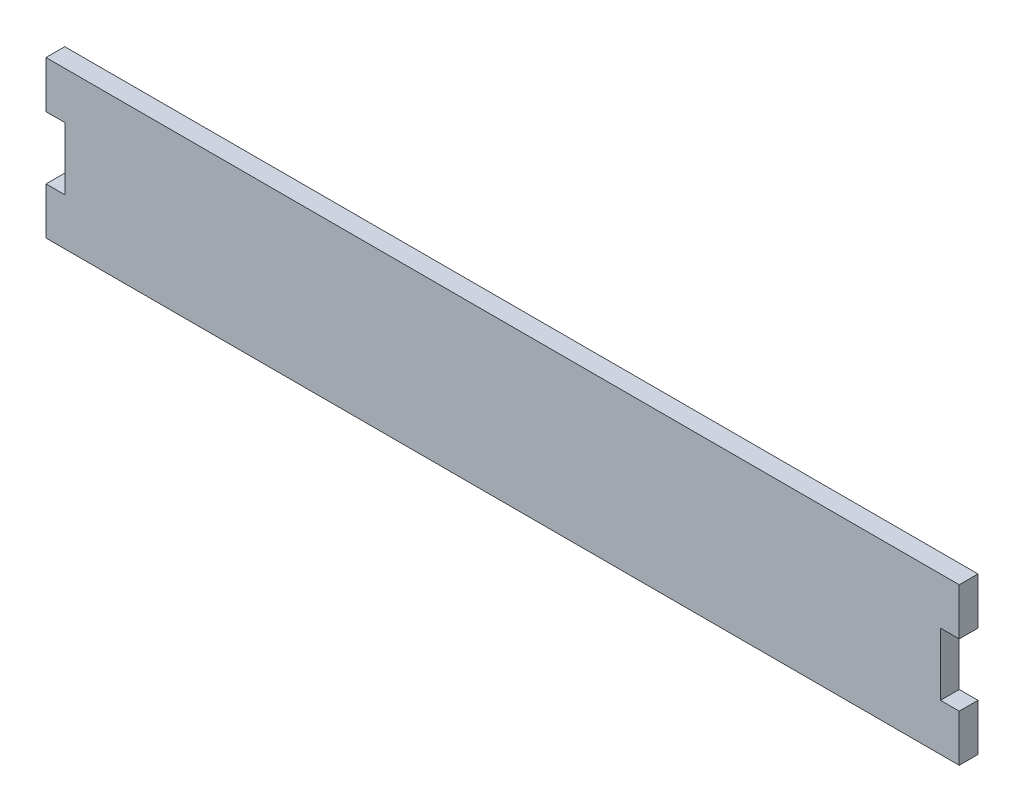
ISO-10303-21;
HEADER;
FILE_DESCRIPTION(('STEP AP214'),'2;1');
FILE_NAME('part.step','',(''),(''),'','','');
FILE_SCHEMA(('AUTOMOTIVE_DESIGN { 1 0 10303 214 1 1 1 1 }'));
ENDSEC;
DATA;
#1=APPLICATION_CONTEXT('core data for automotive mechanical design processes');
#2=APPLICATION_PROTOCOL_DEFINITION('international standard','automotive_design',2000,#1);
#3=PRODUCT_CONTEXT('',#1,'mechanical');
#4=PRODUCT('Part','Part','',(#3));
#5=PRODUCT_RELATED_PRODUCT_CATEGORY('part','',(#4));
#6=PRODUCT_DEFINITION_FORMATION('','',#4);
#7=PRODUCT_DEFINITION_CONTEXT('part definition',#1,'design');
#8=PRODUCT_DEFINITION('design','',#6,#7);
#9=PRODUCT_DEFINITION_SHAPE('','',#8);
#10=(LENGTH_UNIT() NAMED_UNIT(*) SI_UNIT(.MILLI.,.METRE.));
#11=(NAMED_UNIT(*) PLANE_ANGLE_UNIT() SI_UNIT($,.RADIAN.));
#12=(NAMED_UNIT(*) SI_UNIT($,.STERADIAN.) SOLID_ANGLE_UNIT());
#13=UNCERTAINTY_MEASURE_WITH_UNIT(LENGTH_MEASURE(1.E-05),#10,'distance_accuracy_value','');
#14=(GEOMETRIC_REPRESENTATION_CONTEXT(3) GLOBAL_UNCERTAINTY_ASSIGNED_CONTEXT((#13)) GLOBAL_UNIT_ASSIGNED_CONTEXT((#10,
#11,#12)) REPRESENTATION_CONTEXT('',''));
#15=CARTESIAN_POINT('',(0.,0.,0.));
#16=DIRECTION('',(0.,0.,1.));
#17=DIRECTION('',(1.,0.,0.));
#18=AXIS2_PLACEMENT_3D('',#15,#16,#17);
#19=CARTESIAN_POINT('',(292.,0.,6.));
#20=DIRECTION('',(-1.,0.,0.));
#21=DIRECTION('',(0.,0.,1.));
#22=AXIS2_PLACEMENT_3D('',#19,#20,#21);
#23=PLANE('',#22);
#24=DIRECTION('',(0.,1.,0.));
#25=VECTOR('',#24,1.);
#26=CARTESIAN_POINT('',(292.,0.,6.));
#27=LINE('',#26,#25);
#28=CARTESIAN_POINT('',(292.,35.,6.));
#29=VERTEX_POINT('',#28);
#30=CARTESIAN_POINT('',(292.,50.,6.));
#31=VERTEX_POINT('',#30);
#32=EDGE_CURVE('E145',#29,#31,#27,.T.);
#33=ORIENTED_EDGE('',*,*,#32,.F.);
#34=DIRECTION('',(0.,0.,-1.));
#35=VECTOR('',#34,1.);
#36=CARTESIAN_POINT('',(292.,35.,6.));
#37=LINE('',#36,#35);
#38=CARTESIAN_POINT('',(292.,35.,0.));
#39=VERTEX_POINT('',#38);
#40=EDGE_CURVE('E183',#29,#39,#37,.T.);
#41=ORIENTED_EDGE('',*,*,#40,.T.);
#42=DIRECTION('',(0.,1.,0.));
#43=VECTOR('',#42,1.);
#44=CARTESIAN_POINT('',(292.,0.,0.));
#45=LINE('',#44,#43);
#46=CARTESIAN_POINT('',(292.,50.,0.));
#47=VERTEX_POINT('',#46);
#48=EDGE_CURVE('E158',#39,#47,#45,.T.);
#49=ORIENTED_EDGE('',*,*,#48,.T.);
#50=DIRECTION('',(0.,0.,-1.));
#51=VECTOR('',#50,1.);
#52=CARTESIAN_POINT('',(292.,50.,6.));
#53=LINE('',#52,#51);
#54=EDGE_CURVE('E165',#31,#47,#53,.T.);
#55=ORIENTED_EDGE('',*,*,#54,.F.);
#56=EDGE_LOOP('',(#33,#41,#49,#55));
#57=FACE_BOUND('',#56,.T.);
#58=ADVANCED_FACE('F32',(#57),#23,.F.);
#59=CARTESIAN_POINT('',(0.,0.,6.));
#60=DIRECTION('',(1.,0.,0.));
#61=DIRECTION('',(0.,0.,-1.));
#62=AXIS2_PLACEMENT_3D('',#59,#60,#61);
#63=PLANE('',#62);
#64=DIRECTION('',(0.,-1.,0.));
#65=VECTOR('',#64,1.);
#66=CARTESIAN_POINT('',(0.,0.,0.));
#67=LINE('',#66,#65);
#68=CARTESIAN_POINT('',(0.,50.,0.));
#69=VERTEX_POINT('',#68);
#70=CARTESIAN_POINT('',(0.,35.,0.));
#71=VERTEX_POINT('',#70);
#72=EDGE_CURVE('E152',#69,#71,#67,.T.);
#73=ORIENTED_EDGE('',*,*,#72,.T.);
#74=DIRECTION('',(0.,0.,-1.));
#75=VECTOR('',#74,1.);
#76=CARTESIAN_POINT('',(0.,35.,6.));
#77=LINE('',#76,#75);
#78=CARTESIAN_POINT('',(0.,35.,6.));
#79=VERTEX_POINT('',#78);
#80=EDGE_CURVE('E207',#79,#71,#77,.T.);
#81=ORIENTED_EDGE('',*,*,#80,.F.);
#82=DIRECTION('',(0.,-1.,0.));
#83=VECTOR('',#82,1.);
#84=CARTESIAN_POINT('',(0.,0.,6.));
#85=LINE('',#84,#83);
#86=CARTESIAN_POINT('',(0.,50.,6.));
#87=VERTEX_POINT('',#86);
#88=EDGE_CURVE('E212',#87,#79,#85,.T.);
#89=ORIENTED_EDGE('',*,*,#88,.F.);
#90=DIRECTION('',(0.,0.,-1.));
#91=VECTOR('',#90,1.);
#92=CARTESIAN_POINT('',(0.,50.,6.));
#93=LINE('',#92,#91);
#94=EDGE_CURVE('E147',#87,#69,#93,.T.);
#95=ORIENTED_EDGE('',*,*,#94,.T.);
#96=EDGE_LOOP('',(#73,#81,#89,#95));
#97=FACE_BOUND('',#96,.T.);
#98=ADVANCED_FACE('F230',(#97),#63,.F.);
#99=CARTESIAN_POINT('',(0.,15.,6.));
#100=VERTEX_POINT('',#99);
#101=CARTESIAN_POINT('',(0.,0.,6.));
#102=VERTEX_POINT('',#101);
#103=EDGE_CURVE('E162',#100,#102,#85,.T.);
#104=ORIENTED_EDGE('',*,*,#103,.F.);
#105=DIRECTION('',(0.,0.,-1.));
#106=VECTOR('',#105,1.);
#107=CARTESIAN_POINT('',(0.,15.,6.));
#108=LINE('',#107,#106);
#109=CARTESIAN_POINT('',(0.,15.,0.));
#110=VERTEX_POINT('',#109);
#111=EDGE_CURVE('E209',#100,#110,#108,.T.);
#112=ORIENTED_EDGE('',*,*,#111,.T.);
#113=CARTESIAN_POINT('',(0.,0.,0.));
#114=VERTEX_POINT('',#113);
#115=EDGE_CURVE('E156',#110,#114,#67,.T.);
#116=ORIENTED_EDGE('',*,*,#115,.T.);
#117=DIRECTION('',(0.,0.,-1.));
#118=VECTOR('',#117,1.);
#119=CARTESIAN_POINT('',(0.,0.,6.));
#120=LINE('',#119,#118);
#121=EDGE_CURVE('E11',#102,#114,#120,.T.);
#122=ORIENTED_EDGE('',*,*,#121,.F.);
#123=EDGE_LOOP('',(#104,#112,#116,#122));
#124=FACE_BOUND('',#123,.T.);
#125=ADVANCED_FACE('F34',(#124),#63,.F.);
#126=CARTESIAN_POINT('',(0.,0.,6.));
#127=DIRECTION('',(0.,1.,0.));
#128=DIRECTION('',(0.,0.,1.));
#129=AXIS2_PLACEMENT_3D('',#126,#127,#128);
#130=PLANE('',#129);
#131=DIRECTION('',(1.,0.,0.));
#132=VECTOR('',#131,1.);
#133=CARTESIAN_POINT('',(0.,0.,0.));
#134=LINE('',#133,#132);
#135=CARTESIAN_POINT('',(292.,0.,0.));
#136=VERTEX_POINT('',#135);
#137=EDGE_CURVE('E155',#114,#136,#134,.T.);
#138=ORIENTED_EDGE('',*,*,#137,.T.);
#139=DIRECTION('',(0.,0.,-1.));
#140=VECTOR('',#139,1.);
#141=CARTESIAN_POINT('',(292.,0.,6.));
#142=LINE('',#141,#140);
#143=CARTESIAN_POINT('',(292.,0.,6.));
#144=VERTEX_POINT('',#143);
#145=EDGE_CURVE('E40',#144,#136,#142,.T.);
#146=ORIENTED_EDGE('',*,*,#145,.F.);
#147=DIRECTION('',(1.,0.,0.));
#148=VECTOR('',#147,1.);
#149=CARTESIAN_POINT('',(0.,0.,6.));
#150=LINE('',#149,#148);
#151=EDGE_CURVE('E142',#102,#144,#150,.T.);
#152=ORIENTED_EDGE('',*,*,#151,.F.);
#153=ORIENTED_EDGE('',*,*,#121,.T.);
#154=EDGE_LOOP('',(#138,#146,#152,#153));
#155=FACE_BOUND('',#154,.T.);
#156=ADVANCED_FACE('F219',(#155),#130,.F.);
#157=CARTESIAN_POINT('',(292.,15.,0.));
#158=VERTEX_POINT('',#157);
#159=EDGE_CURVE('E137',#136,#158,#45,.T.);
#160=ORIENTED_EDGE('',*,*,#159,.T.);
#161=DIRECTION('',(0.,0.,-1.));
#162=VECTOR('',#161,1.);
#163=CARTESIAN_POINT('',(292.,15.,6.));
#164=LINE('',#163,#162);
#165=CARTESIAN_POINT('',(292.,15.,6.));
#166=VERTEX_POINT('',#165);
#167=EDGE_CURVE('E47',#166,#158,#164,.T.);
#168=ORIENTED_EDGE('',*,*,#167,.F.);
#169=EDGE_CURVE('E135',#144,#166,#27,.T.);
#170=ORIENTED_EDGE('',*,*,#169,.F.);
#171=ORIENTED_EDGE('',*,*,#145,.T.);
#172=EDGE_LOOP('',(#160,#168,#170,#171));
#173=FACE_BOUND('',#172,.T.);
#174=ADVANCED_FACE('F133',(#173),#23,.F.);
#175=CARTESIAN_POINT('',(0.,50.,6.));
#176=DIRECTION('',(0.,-1.,0.));
#177=DIRECTION('',(0.,0.,-1.));
#178=AXIS2_PLACEMENT_3D('',#175,#176,#177);
#179=PLANE('',#178);
#180=DIRECTION('',(-1.,0.,0.));
#181=VECTOR('',#180,1.);
#182=CARTESIAN_POINT('',(0.,50.,0.));
#183=LINE('',#182,#181);
#184=EDGE_CURVE('E160',#47,#69,#183,.T.);
#185=ORIENTED_EDGE('',*,*,#184,.T.);
#186=ORIENTED_EDGE('',*,*,#94,.F.);
#187=DIRECTION('',(-1.,0.,0.));
#188=VECTOR('',#187,1.);
#189=CARTESIAN_POINT('',(0.,50.,6.));
#190=LINE('',#189,#188);
#191=EDGE_CURVE('E144',#31,#87,#190,.T.);
#192=ORIENTED_EDGE('',*,*,#191,.F.);
#193=ORIENTED_EDGE('',*,*,#54,.T.);
#194=EDGE_LOOP('',(#185,#186,#192,#193));
#195=FACE_BOUND('',#194,.T.);
#196=ADVANCED_FACE('F236',(#195),#179,.F.);
#197=CARTESIAN_POINT('',(0.,0.,6.));
#198=DIRECTION('',(0.,0.,-1.));
#199=DIRECTION('',(-1.,0.,0.));
#200=AXIS2_PLACEMENT_3D('',#197,#198,#199);
#201=PLANE('',#200);
#202=DIRECTION('',(0.,1.,0.));
#203=VECTOR('',#202,1.);
#204=CARTESIAN_POINT('',(286.,15.,6.));
#205=LINE('',#204,#203);
#206=CARTESIAN_POINT('',(286.,15.,6.));
#207=VERTEX_POINT('',#206);
#208=CARTESIAN_POINT('',(286.,35.,6.));
#209=VERTEX_POINT('',#208);
#210=EDGE_CURVE('E127',#207,#209,#205,.T.);
#211=ORIENTED_EDGE('',*,*,#210,.T.);
#212=DIRECTION('',(1.,0.,0.));
#213=VECTOR('',#212,1.);
#214=CARTESIAN_POINT('',(292.,35.,6.));
#215=LINE('',#214,#213);
#216=EDGE_CURVE('E138',#209,#29,#215,.T.);
#217=ORIENTED_EDGE('',*,*,#216,.T.);
#218=ORIENTED_EDGE('',*,*,#32,.T.);
#219=ORIENTED_EDGE('',*,*,#191,.T.);
#220=ORIENTED_EDGE('',*,*,#88,.T.);
#221=DIRECTION('',(1.,0.,0.));
#222=VECTOR('',#221,1.);
#223=CARTESIAN_POINT('',(6.,35.,6.));
#224=LINE('',#223,#222);
#225=CARTESIAN_POINT('',(6.,35.,6.));
#226=VERTEX_POINT('',#225);
#227=EDGE_CURVE('E196',#79,#226,#224,.T.);
#228=ORIENTED_EDGE('',*,*,#227,.T.);
#229=DIRECTION('',(0.,-1.,0.));
#230=VECTOR('',#229,1.);
#231=CARTESIAN_POINT('',(6.,15.,6.));
#232=LINE('',#231,#230);
#233=CARTESIAN_POINT('',(6.,15.,6.));
#234=VERTEX_POINT('',#233);
#235=EDGE_CURVE('E189',#226,#234,#232,.T.);
#236=ORIENTED_EDGE('',*,*,#235,.T.);
#237=DIRECTION('',(-1.,0.,0.));
#238=VECTOR('',#237,1.);
#239=CARTESIAN_POINT('',(6.,15.,6.));
#240=LINE('',#239,#238);
#241=EDGE_CURVE('E192',#234,#100,#240,.T.);
#242=ORIENTED_EDGE('',*,*,#241,.T.);
#243=ORIENTED_EDGE('',*,*,#103,.T.);
#244=ORIENTED_EDGE('',*,*,#151,.T.);
#245=ORIENTED_EDGE('',*,*,#169,.T.);
#246=DIRECTION('',(-1.,0.,0.));
#247=VECTOR('',#246,1.);
#248=CARTESIAN_POINT('',(292.,15.,6.));
#249=LINE('',#248,#247);
#250=EDGE_CURVE('E120',#166,#207,#249,.T.);
#251=ORIENTED_EDGE('',*,*,#250,.T.);
#252=EDGE_LOOP('',(#211,#217,#218,#219,#220,#228,#236,#242,#243,#244,#245,#251));
#253=FACE_BOUND('',#252,.T.);
#254=ADVANCED_FACE('F140',(#253),#201,.F.);
#255=CARTESIAN_POINT('',(0.,0.,0.));
#256=DIRECTION('',(0.,0.,-1.));
#257=DIRECTION('',(-1.,0.,0.));
#258=AXIS2_PLACEMENT_3D('',#255,#256,#257);
#259=PLANE('',#258);
#260=DIRECTION('',(1.,0.,0.));
#261=VECTOR('',#260,1.);
#262=CARTESIAN_POINT('',(292.,35.,0.));
#263=LINE('',#262,#261);
#264=CARTESIAN_POINT('',(286.,35.,0.));
#265=VERTEX_POINT('',#264);
#266=EDGE_CURVE('E128',#265,#39,#263,.T.);
#267=ORIENTED_EDGE('',*,*,#266,.F.);
#268=DIRECTION('',(0.,1.,0.));
#269=VECTOR('',#268,1.);
#270=CARTESIAN_POINT('',(286.,15.,0.));
#271=LINE('',#270,#269);
#272=CARTESIAN_POINT('',(286.,15.,0.));
#273=VERTEX_POINT('',#272);
#274=EDGE_CURVE('E176',#273,#265,#271,.T.);
#275=ORIENTED_EDGE('',*,*,#274,.F.);
#276=DIRECTION('',(-1.,0.,0.));
#277=VECTOR('',#276,1.);
#278=CARTESIAN_POINT('',(292.,15.,0.));
#279=LINE('',#278,#277);
#280=EDGE_CURVE('E174',#158,#273,#279,.T.);
#281=ORIENTED_EDGE('',*,*,#280,.F.);
#282=ORIENTED_EDGE('',*,*,#159,.F.);
#283=ORIENTED_EDGE('',*,*,#137,.F.);
#284=ORIENTED_EDGE('',*,*,#115,.F.);
#285=DIRECTION('',(-1.,0.,0.));
#286=VECTOR('',#285,1.);
#287=CARTESIAN_POINT('',(6.,15.,0.));
#288=LINE('',#287,#286);
#289=CARTESIAN_POINT('',(6.,15.,0.));
#290=VERTEX_POINT('',#289);
#291=EDGE_CURVE('E201',#290,#110,#288,.T.);
#292=ORIENTED_EDGE('',*,*,#291,.F.);
#293=DIRECTION('',(0.,-1.,0.));
#294=VECTOR('',#293,1.);
#295=CARTESIAN_POINT('',(6.,15.,0.));
#296=LINE('',#295,#294);
#297=CARTESIAN_POINT('',(6.,35.,0.));
#298=VERTEX_POINT('',#297);
#299=EDGE_CURVE('E55',#298,#290,#296,.T.);
#300=ORIENTED_EDGE('',*,*,#299,.F.);
#301=DIRECTION('',(1.,0.,0.));
#302=VECTOR('',#301,1.);
#303=CARTESIAN_POINT('',(6.,35.,0.));
#304=LINE('',#303,#302);
#305=EDGE_CURVE('E193',#71,#298,#304,.T.);
#306=ORIENTED_EDGE('',*,*,#305,.F.);
#307=ORIENTED_EDGE('',*,*,#72,.F.);
#308=ORIENTED_EDGE('',*,*,#184,.F.);
#309=ORIENTED_EDGE('',*,*,#48,.F.);
#310=EDGE_LOOP('',(#267,#275,#281,#282,#283,#284,#292,#300,#306,#307,#308,#309));
#311=FACE_BOUND('',#310,.T.);
#312=ADVANCED_FACE('F171',(#311),#259,.T.);
#313=CARTESIAN_POINT('',(6.,15.,6.));
#314=DIRECTION('',(1.,0.,0.));
#315=DIRECTION('',(0.,0.,-1.));
#316=AXIS2_PLACEMENT_3D('',#313,#314,#315);
#317=PLANE('',#316);
#318=ORIENTED_EDGE('',*,*,#299,.T.);
#319=DIRECTION('',(0.,0.,-1.));
#320=VECTOR('',#319,1.);
#321=CARTESIAN_POINT('',(6.,15.,6.));
#322=LINE('',#321,#320);
#323=EDGE_CURVE('E199',#234,#290,#322,.T.);
#324=ORIENTED_EDGE('',*,*,#323,.F.);
#325=ORIENTED_EDGE('',*,*,#235,.F.);
#326=DIRECTION('',(0.,0.,-1.));
#327=VECTOR('',#326,1.);
#328=CARTESIAN_POINT('',(6.,35.,6.));
#329=LINE('',#328,#327);
#330=EDGE_CURVE('E205',#226,#298,#329,.T.);
#331=ORIENTED_EDGE('',*,*,#330,.T.);
#332=EDGE_LOOP('',(#318,#324,#325,#331));
#333=FACE_BOUND('',#332,.T.);
#334=ADVANCED_FACE('F225',(#333),#317,.F.);
#335=CARTESIAN_POINT('',(6.,35.,6.));
#336=DIRECTION('',(0.,1.,0.));
#337=DIRECTION('',(0.,0.,1.));
#338=AXIS2_PLACEMENT_3D('',#335,#336,#337);
#339=PLANE('',#338);
#340=ORIENTED_EDGE('',*,*,#305,.T.);
#341=ORIENTED_EDGE('',*,*,#330,.F.);
#342=ORIENTED_EDGE('',*,*,#227,.F.);
#343=ORIENTED_EDGE('',*,*,#80,.T.);
#344=EDGE_LOOP('',(#340,#341,#342,#343));
#345=FACE_BOUND('',#344,.T.);
#346=ADVANCED_FACE('F228',(#345),#339,.F.);
#347=CARTESIAN_POINT('',(6.,15.,6.));
#348=DIRECTION('',(0.,-1.,0.));
#349=DIRECTION('',(0.,0.,-1.));
#350=AXIS2_PLACEMENT_3D('',#347,#348,#349);
#351=PLANE('',#350);
#352=ORIENTED_EDGE('',*,*,#291,.T.);
#353=ORIENTED_EDGE('',*,*,#111,.F.);
#354=ORIENTED_EDGE('',*,*,#241,.F.);
#355=ORIENTED_EDGE('',*,*,#323,.T.);
#356=EDGE_LOOP('',(#352,#353,#354,#355));
#357=FACE_BOUND('',#356,.T.);
#358=ADVANCED_FACE('F223',(#357),#351,.F.);
#359=CARTESIAN_POINT('',(292.,35.,6.));
#360=DIRECTION('',(0.,1.,0.));
#361=DIRECTION('',(0.,0.,1.));
#362=AXIS2_PLACEMENT_3D('',#359,#360,#361);
#363=PLANE('',#362);
#364=ORIENTED_EDGE('',*,*,#266,.T.);
#365=ORIENTED_EDGE('',*,*,#40,.F.);
#366=ORIENTED_EDGE('',*,*,#216,.F.);
#367=DIRECTION('',(0.,0.,-1.));
#368=VECTOR('',#367,1.);
#369=CARTESIAN_POINT('',(286.,35.,6.));
#370=LINE('',#369,#368);
#371=EDGE_CURVE('E186',#209,#265,#370,.T.);
#372=ORIENTED_EDGE('',*,*,#371,.T.);
#373=EDGE_LOOP('',(#364,#365,#366,#372));
#374=FACE_BOUND('',#373,.T.);
#375=ADVANCED_FACE('F244',(#374),#363,.F.);
#376=CARTESIAN_POINT('',(286.,15.,6.));
#377=DIRECTION('',(-1.,0.,0.));
#378=DIRECTION('',(0.,0.,1.));
#379=AXIS2_PLACEMENT_3D('',#376,#377,#378);
#380=PLANE('',#379);
#381=ORIENTED_EDGE('',*,*,#274,.T.);
#382=ORIENTED_EDGE('',*,*,#371,.F.);
#383=ORIENTED_EDGE('',*,*,#210,.F.);
#384=DIRECTION('',(0.,0.,-1.));
#385=VECTOR('',#384,1.);
#386=CARTESIAN_POINT('',(286.,15.,6.));
#387=LINE('',#386,#385);
#388=EDGE_CURVE('E122',#207,#273,#387,.T.);
#389=ORIENTED_EDGE('',*,*,#388,.T.);
#390=EDGE_LOOP('',(#381,#382,#383,#389));
#391=FACE_BOUND('',#390,.T.);
#392=ADVANCED_FACE('F246',(#391),#380,.F.);
#393=CARTESIAN_POINT('',(292.,15.,6.));
#394=DIRECTION('',(0.,-1.,0.));
#395=DIRECTION('',(0.,0.,-1.));
#396=AXIS2_PLACEMENT_3D('',#393,#394,#395);
#397=PLANE('',#396);
#398=ORIENTED_EDGE('',*,*,#280,.T.);
#399=ORIENTED_EDGE('',*,*,#388,.F.);
#400=ORIENTED_EDGE('',*,*,#250,.F.);
#401=ORIENTED_EDGE('',*,*,#167,.T.);
#402=EDGE_LOOP('',(#398,#399,#400,#401));
#403=FACE_BOUND('',#402,.T.);
#404=ADVANCED_FACE('F121',(#403),#397,.F.);
#405=CLOSED_SHELL('',(#58,#98,#125,#156,#174,#196,#254,#312,#334,#346,#358,#375,#392,#404));
#406=MANIFOLD_SOLID_BREP('B2',#405);
#407=ADVANCED_BREP_SHAPE_REPRESENTATION('',(#18,#406),#14);
#408=SHAPE_DEFINITION_REPRESENTATION(#9,#407);
ENDSEC;
END-ISO-10303-21;
